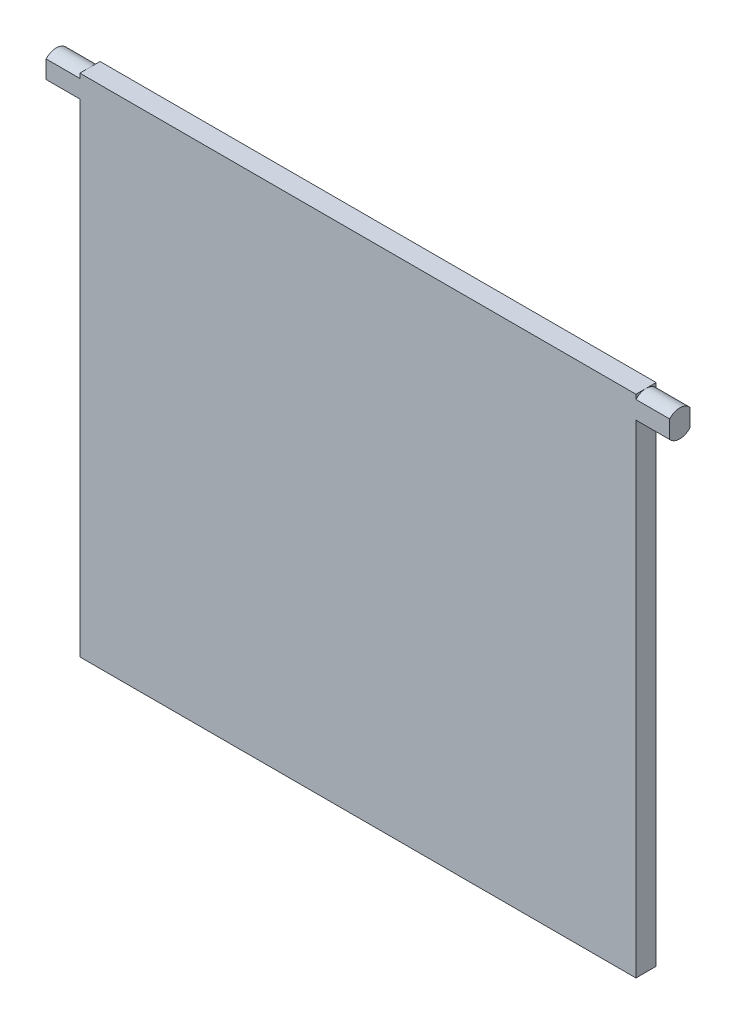
ISO-10303-21;
HEADER;
FILE_DESCRIPTION(('STEP AP214'),'2;1');
FILE_NAME('part.step','',(''),(''),'','','');
FILE_SCHEMA(('AUTOMOTIVE_DESIGN { 1 0 10303 214 1 1 1 1 }'));
ENDSEC;
DATA;
#1=APPLICATION_CONTEXT('core data for automotive mechanical design processes');
#2=APPLICATION_PROTOCOL_DEFINITION('international standard','automotive_design',2000,#1);
#3=PRODUCT_CONTEXT('',#1,'mechanical');
#4=PRODUCT('Part','Part','',(#3));
#5=PRODUCT_RELATED_PRODUCT_CATEGORY('part','',(#4));
#6=PRODUCT_DEFINITION_FORMATION('','',#4);
#7=PRODUCT_DEFINITION_CONTEXT('part definition',#1,'design');
#8=PRODUCT_DEFINITION('design','',#6,#7);
#9=PRODUCT_DEFINITION_SHAPE('','',#8);
#10=(LENGTH_UNIT() NAMED_UNIT(*) SI_UNIT(.MILLI.,.METRE.));
#11=(NAMED_UNIT(*) PLANE_ANGLE_UNIT() SI_UNIT($,.RADIAN.));
#12=(NAMED_UNIT(*) SI_UNIT($,.STERADIAN.) SOLID_ANGLE_UNIT());
#13=UNCERTAINTY_MEASURE_WITH_UNIT(LENGTH_MEASURE(1.E-05),#10,'distance_accuracy_value','');
#14=(GEOMETRIC_REPRESENTATION_CONTEXT(3) GLOBAL_UNCERTAINTY_ASSIGNED_CONTEXT((#13)) GLOBAL_UNIT_ASSIGNED_CONTEXT((#10,
#11,#12)) REPRESENTATION_CONTEXT('',''));
#15=CARTESIAN_POINT('',(0.,0.,0.));
#16=DIRECTION('',(0.,0.,1.));
#17=DIRECTION('',(1.,0.,0.));
#18=AXIS2_PLACEMENT_3D('',#15,#16,#17);
#19=CARTESIAN_POINT('',(0.,-1.2,1.2));
#20=DIRECTION('',(1.,0.,0.));
#21=DIRECTION('',(0.,1.,0.));
#22=AXIS2_PLACEMENT_3D('',#19,#20,#21);
#23=PLANE('',#22);
#24=DIRECTION('',(0.,-1.,0.));
#25=VECTOR('',#24,1.);
#26=CARTESIAN_POINT('',(0.,-1.2,0.));
#27=LINE('',#26,#25);
#28=CARTESIAN_POINT('',(0.,0.,0.));
#29=VERTEX_POINT('',#28);
#30=CARTESIAN_POINT('',(0.,-0.270849737787085,0.));
#31=VERTEX_POINT('',#30);
#32=EDGE_CURVE('E228',#29,#31,#27,.T.);
#33=ORIENTED_EDGE('',*,*,#32,.T.);
#34=CARTESIAN_POINT('',(0.,-0.800000000000004,0.6));
#35=DIRECTION('',(1.,0.,0.));
#36=DIRECTION('',(0.,0.,-1.));
#37=AXIS2_PLACEMENT_3D('',#34,#35,#36);
#38=CIRCLE('',#37,0.8);
#39=CARTESIAN_POINT('',(0.,0.,0.6));
#40=VERTEX_POINT('',#39);
#41=EDGE_CURVE('E53',#31,#40,#38,.T.);
#42=ORIENTED_EDGE('',*,*,#41,.T.);
#43=DIRECTION('',(0.,0.,-1.));
#44=VECTOR('',#43,1.);
#45=CARTESIAN_POINT('',(0.,0.,1.2));
#46=LINE('',#45,#44);
#47=EDGE_CURVE('E227',#40,#29,#46,.T.);
#48=ORIENTED_EDGE('',*,*,#47,.T.);
#49=EDGE_LOOP('',(#33,#42,#48));
#50=FACE_BOUND('',#49,.T.);
#51=ADVANCED_FACE('F41',(#50),#23,.F.);
#52=CARTESIAN_POINT('',(0.,0.,1.2));
#53=VERTEX_POINT('',#52);
#54=EDGE_CURVE('E244',#53,#40,#46,.T.);
#55=ORIENTED_EDGE('',*,*,#54,.T.);
#56=CARTESIAN_POINT('',(0.,-0.270849737787086,1.2));
#57=VERTEX_POINT('',#56);
#58=EDGE_CURVE('E11',#40,#57,#38,.T.);
#59=ORIENTED_EDGE('',*,*,#58,.T.);
#60=DIRECTION('',(0.,-1.,0.));
#61=VECTOR('',#60,1.);
#62=CARTESIAN_POINT('',(0.,-1.2,1.2));
#63=LINE('',#62,#61);
#64=EDGE_CURVE('E212',#53,#57,#63,.T.);
#65=ORIENTED_EDGE('',*,*,#64,.F.);
#66=EDGE_LOOP('',(#55,#59,#65));
#67=FACE_BOUND('',#66,.T.);
#68=ADVANCED_FACE('F299',(#67),#23,.F.);
#69=CARTESIAN_POINT('',(33.,-1.2,1.2));
#70=DIRECTION('',(-1.,0.,0.));
#71=DIRECTION('',(0.,0.,1.));
#72=AXIS2_PLACEMENT_3D('',#69,#70,#71);
#73=PLANE('',#72);
#74=CARTESIAN_POINT('',(33.,-0.8,0.6));
#75=DIRECTION('',(1.,0.,0.));
#76=DIRECTION('',(0.,0.,-1.));
#77=AXIS2_PLACEMENT_3D('',#74,#75,#76);
#78=CIRCLE('',#77,0.8);
#79=CARTESIAN_POINT('',(33.,-1.32915026221292,1.2));
#80=VERTEX_POINT('',#79);
#81=CARTESIAN_POINT('',(33.,-1.32915026221292,0.));
#82=VERTEX_POINT('',#81);
#83=EDGE_CURVE('E69',#80,#82,#78,.T.);
#84=ORIENTED_EDGE('',*,*,#83,.F.);
#85=DIRECTION('',(0.,1.,0.));
#86=VECTOR('',#85,1.);
#87=CARTESIAN_POINT('',(33.,-1.2,1.2));
#88=LINE('',#87,#86);
#89=CARTESIAN_POINT('',(33.,-30.,1.2));
#90=VERTEX_POINT('',#89);
#91=EDGE_CURVE('E221',#90,#80,#88,.T.);
#92=ORIENTED_EDGE('',*,*,#91,.F.);
#93=DIRECTION('',(0.,0.,-1.));
#94=VECTOR('',#93,1.);
#95=CARTESIAN_POINT('',(33.,-30.,1.2));
#96=LINE('',#95,#94);
#97=CARTESIAN_POINT('',(33.,-30.,0.));
#98=VERTEX_POINT('',#97);
#99=EDGE_CURVE('E252',#90,#98,#96,.T.);
#100=ORIENTED_EDGE('',*,*,#99,.T.);
#101=DIRECTION('',(0.,1.,0.));
#102=VECTOR('',#101,1.);
#103=CARTESIAN_POINT('',(33.,-1.2,0.));
#104=LINE('',#103,#102);
#105=EDGE_CURVE('E237',#98,#82,#104,.T.);
#106=ORIENTED_EDGE('',*,*,#105,.T.);
#107=EDGE_LOOP('',(#84,#92,#100,#106));
#108=FACE_BOUND('',#107,.T.);
#109=ADVANCED_FACE('F307',(#108),#73,.F.);
#110=CARTESIAN_POINT('',(33.,-0.270849737787081,0.));
#111=VERTEX_POINT('',#110);
#112=CARTESIAN_POINT('',(33.,0.,0.6));
#113=VERTEX_POINT('',#112);
#114=EDGE_CURVE('E151',#111,#113,#78,.T.);
#115=ORIENTED_EDGE('',*,*,#114,.F.);
#116=CARTESIAN_POINT('',(33.,0.,0.));
#117=VERTEX_POINT('',#116);
#118=EDGE_CURVE('E236',#111,#117,#104,.T.);
#119=ORIENTED_EDGE('',*,*,#118,.T.);
#120=DIRECTION('',(0.,0.,-1.));
#121=VECTOR('',#120,1.);
#122=CARTESIAN_POINT('',(33.,0.,1.2));
#123=LINE('',#122,#121);
#124=EDGE_CURVE('E248',#113,#117,#123,.T.);
#125=ORIENTED_EDGE('',*,*,#124,.F.);
#126=EDGE_LOOP('',(#115,#119,#125));
#127=FACE_BOUND('',#126,.T.);
#128=ADVANCED_FACE('F293',(#127),#73,.F.);
#129=CARTESIAN_POINT('',(0.,-1.32915026221292,1.2));
#130=VERTEX_POINT('',#129);
#131=CARTESIAN_POINT('',(0.,-30.,1.2));
#132=VERTEX_POINT('',#131);
#133=EDGE_CURVE('E217',#130,#132,#63,.T.);
#134=ORIENTED_EDGE('',*,*,#133,.F.);
#135=CARTESIAN_POINT('',(0.,-1.32915026221292,0.));
#136=VERTEX_POINT('',#135);
#137=EDGE_CURVE('E54',#130,#136,#38,.T.);
#138=ORIENTED_EDGE('',*,*,#137,.T.);
#139=CARTESIAN_POINT('',(0.,-30.,0.));
#140=VERTEX_POINT('',#139);
#141=EDGE_CURVE('E149',#136,#140,#27,.T.);
#142=ORIENTED_EDGE('',*,*,#141,.T.);
#143=DIRECTION('',(0.,0.,-1.));
#144=VECTOR('',#143,1.);
#145=CARTESIAN_POINT('',(0.,-30.,1.2));
#146=LINE('',#145,#144);
#147=EDGE_CURVE('E45',#132,#140,#146,.T.);
#148=ORIENTED_EDGE('',*,*,#147,.F.);
#149=EDGE_LOOP('',(#134,#138,#142,#148));
#150=FACE_BOUND('',#149,.T.);
#151=ADVANCED_FACE('F43',(#150),#23,.F.);
#152=CARTESIAN_POINT('',(0.,-30.,1.2));
#153=DIRECTION('',(0.,1.,0.));
#154=DIRECTION('',(-1.,0.,0.));
#155=AXIS2_PLACEMENT_3D('',#152,#153,#154);
#156=PLANE('',#155);
#157=DIRECTION('',(1.,0.,0.));
#158=VECTOR('',#157,1.);
#159=CARTESIAN_POINT('',(0.,-30.,0.));
#160=LINE('',#159,#158);
#161=EDGE_CURVE('E232',#140,#98,#160,.T.);
#162=ORIENTED_EDGE('',*,*,#161,.T.);
#163=ORIENTED_EDGE('',*,*,#99,.F.);
#164=DIRECTION('',(1.,0.,0.));
#165=VECTOR('',#164,1.);
#166=CARTESIAN_POINT('',(0.,-30.,1.2));
#167=LINE('',#166,#165);
#168=EDGE_CURVE('E216',#132,#90,#167,.T.);
#169=ORIENTED_EDGE('',*,*,#168,.F.);
#170=ORIENTED_EDGE('',*,*,#147,.T.);
#171=EDGE_LOOP('',(#162,#163,#169,#170));
#172=FACE_BOUND('',#171,.T.);
#173=ADVANCED_FACE('F305',(#172),#156,.F.);
#174=CARTESIAN_POINT('',(33.,-0.270849737787082,1.2));
#175=VERTEX_POINT('',#174);
#176=EDGE_CURVE('E51',#113,#175,#78,.T.);
#177=ORIENTED_EDGE('',*,*,#176,.F.);
#178=CARTESIAN_POINT('',(33.,0.,1.2));
#179=VERTEX_POINT('',#178);
#180=EDGE_CURVE('E249',#179,#113,#123,.T.);
#181=ORIENTED_EDGE('',*,*,#180,.F.);
#182=EDGE_CURVE('E220',#175,#179,#88,.T.);
#183=ORIENTED_EDGE('',*,*,#182,.F.);
#184=EDGE_LOOP('',(#177,#181,#183));
#185=FACE_BOUND('',#184,.T.);
#186=ADVANCED_FACE('F303',(#185),#73,.F.);
#187=CARTESIAN_POINT('',(0.,0.,1.2));
#188=DIRECTION('',(0.,-1.,0.));
#189=DIRECTION('',(1.,0.,0.));
#190=AXIS2_PLACEMENT_3D('',#187,#188,#189);
#191=PLANE('',#190);
#192=DIRECTION('',(-1.,0.,0.));
#193=VECTOR('',#192,1.);
#194=CARTESIAN_POINT('',(0.,0.,0.));
#195=LINE('',#194,#193);
#196=EDGE_CURVE('E240',#117,#29,#195,.T.);
#197=ORIENTED_EDGE('',*,*,#196,.T.);
#198=ORIENTED_EDGE('',*,*,#47,.F.);
#199=ORIENTED_EDGE('',*,*,#54,.F.);
#200=DIRECTION('',(-1.,0.,0.));
#201=VECTOR('',#200,1.);
#202=CARTESIAN_POINT('',(0.,0.,1.2));
#203=LINE('',#202,#201);
#204=EDGE_CURVE('E224',#179,#53,#203,.T.);
#205=ORIENTED_EDGE('',*,*,#204,.F.);
#206=ORIENTED_EDGE('',*,*,#180,.T.);
#207=ORIENTED_EDGE('',*,*,#124,.T.);
#208=EDGE_LOOP('',(#197,#198,#199,#205,#206,#207));
#209=FACE_BOUND('',#208,.T.);
#210=ADVANCED_FACE('F287',(#209),#191,.F.);
#211=CARTESIAN_POINT('',(0.,0.,1.2));
#212=DIRECTION('',(0.,0.,-1.));
#213=DIRECTION('',(-1.,0.,0.));
#214=AXIS2_PLACEMENT_3D('',#211,#212,#213);
#215=PLANE('',#214);
#216=ORIENTED_EDGE('',*,*,#64,.T.);
#217=DIRECTION('',(1.,0.,0.));
#218=VECTOR('',#217,1.);
#219=CARTESIAN_POINT('',(-2.,-0.270849737787086,1.2));
#220=LINE('',#219,#218);
#221=CARTESIAN_POINT('',(-2.,-0.270849737787086,1.2));
#222=VERTEX_POINT('',#221);
#223=EDGE_CURVE('E174',#222,#57,#220,.T.);
#224=ORIENTED_EDGE('',*,*,#223,.F.);
#225=DIRECTION('',(0.,-1.,0.));
#226=VECTOR('',#225,1.);
#227=CARTESIAN_POINT('',(-2.,0.,1.2));
#228=LINE('',#227,#226);
#229=CARTESIAN_POINT('',(-2.,-1.32915026221292,1.2));
#230=VERTEX_POINT('',#229);
#231=EDGE_CURVE('E166',#222,#230,#228,.T.);
#232=ORIENTED_EDGE('',*,*,#231,.T.);
#233=DIRECTION('',(1.,0.,0.));
#234=VECTOR('',#233,1.);
#235=CARTESIAN_POINT('',(-2.,-1.32915026221292,1.2));
#236=LINE('',#235,#234);
#237=EDGE_CURVE('E152',#230,#130,#236,.T.);
#238=ORIENTED_EDGE('',*,*,#237,.T.);
#239=ORIENTED_EDGE('',*,*,#133,.T.);
#240=ORIENTED_EDGE('',*,*,#168,.T.);
#241=ORIENTED_EDGE('',*,*,#91,.T.);
#242=DIRECTION('',(-1.,0.,0.));
#243=VECTOR('',#242,1.);
#244=CARTESIAN_POINT('',(35.,-1.32915026221292,1.2));
#245=LINE('',#244,#243);
#246=CARTESIAN_POINT('',(35.,-1.32915026221292,1.2));
#247=VERTEX_POINT('',#246);
#248=EDGE_CURVE('E200',#247,#80,#245,.T.);
#249=ORIENTED_EDGE('',*,*,#248,.F.);
#250=DIRECTION('',(0.,-1.,0.));
#251=VECTOR('',#250,1.);
#252=CARTESIAN_POINT('',(35.,0.,1.2));
#253=LINE('',#252,#251);
#254=CARTESIAN_POINT('',(35.,-0.270849737787082,1.2));
#255=VERTEX_POINT('',#254);
#256=EDGE_CURVE('E189',#255,#247,#253,.T.);
#257=ORIENTED_EDGE('',*,*,#256,.F.);
#258=DIRECTION('',(-1.,0.,0.));
#259=VECTOR('',#258,1.);
#260=CARTESIAN_POINT('',(35.,-0.270849737787082,1.2));
#261=LINE('',#260,#259);
#262=EDGE_CURVE('E204',#255,#175,#261,.T.);
#263=ORIENTED_EDGE('',*,*,#262,.T.);
#264=ORIENTED_EDGE('',*,*,#182,.T.);
#265=ORIENTED_EDGE('',*,*,#204,.T.);
#266=EDGE_LOOP('',(#216,#224,#232,#238,#239,#240,#241,#249,#257,#263,#264,#265));
#267=FACE_BOUND('',#266,.T.);
#268=ADVANCED_FACE('F301',(#267),#215,.F.);
#269=CARTESIAN_POINT('',(0.,0.,0.));
#270=DIRECTION('',(0.,0.,-1.));
#271=DIRECTION('',(-1.,0.,0.));
#272=AXIS2_PLACEMENT_3D('',#269,#270,#271);
#273=PLANE('',#272);
#274=ORIENTED_EDGE('',*,*,#32,.F.);
#275=ORIENTED_EDGE('',*,*,#196,.F.);
#276=ORIENTED_EDGE('',*,*,#118,.F.);
#277=DIRECTION('',(-1.,0.,0.));
#278=VECTOR('',#277,1.);
#279=CARTESIAN_POINT('',(35.,-0.270849737787081,0.));
#280=LINE('',#279,#278);
#281=CARTESIAN_POINT('',(35.,-0.270849737787081,0.));
#282=VERTEX_POINT('',#281);
#283=EDGE_CURVE('E208',#282,#111,#280,.T.);
#284=ORIENTED_EDGE('',*,*,#283,.F.);
#285=DIRECTION('',(0.,1.,0.));
#286=VECTOR('',#285,1.);
#287=CARTESIAN_POINT('',(35.,0.,0.));
#288=LINE('',#287,#286);
#289=CARTESIAN_POINT('',(35.,-1.32915026221292,0.));
#290=VERTEX_POINT('',#289);
#291=EDGE_CURVE('E182',#290,#282,#288,.T.);
#292=ORIENTED_EDGE('',*,*,#291,.F.);
#293=DIRECTION('',(-1.,0.,0.));
#294=VECTOR('',#293,1.);
#295=CARTESIAN_POINT('',(35.,-1.32915026221292,0.));
#296=LINE('',#295,#294);
#297=EDGE_CURVE('E196',#290,#82,#296,.T.);
#298=ORIENTED_EDGE('',*,*,#297,.T.);
#299=ORIENTED_EDGE('',*,*,#105,.F.);
#300=ORIENTED_EDGE('',*,*,#161,.F.);
#301=ORIENTED_EDGE('',*,*,#141,.F.);
#302=DIRECTION('',(1.,0.,0.));
#303=VECTOR('',#302,1.);
#304=CARTESIAN_POINT('',(-2.,-1.32915026221292,0.));
#305=LINE('',#304,#303);
#306=CARTESIAN_POINT('',(-2.,-1.32915026221292,0.));
#307=VERTEX_POINT('',#306);
#308=EDGE_CURVE('E61',#307,#136,#305,.T.);
#309=ORIENTED_EDGE('',*,*,#308,.F.);
#310=DIRECTION('',(0.,1.,0.));
#311=VECTOR('',#310,1.);
#312=CARTESIAN_POINT('',(-2.,0.,0.));
#313=LINE('',#312,#311);
#314=CARTESIAN_POINT('',(-2.,-0.270849737787086,0.));
#315=VERTEX_POINT('',#314);
#316=EDGE_CURVE('E146',#307,#315,#313,.T.);
#317=ORIENTED_EDGE('',*,*,#316,.T.);
#318=DIRECTION('',(1.,0.,0.));
#319=VECTOR('',#318,1.);
#320=CARTESIAN_POINT('',(-2.,-0.270849737787086,0.));
#321=LINE('',#320,#319);
#322=EDGE_CURVE('E171',#315,#31,#321,.T.);
#323=ORIENTED_EDGE('',*,*,#322,.T.);
#324=EDGE_LOOP('',(#274,#275,#276,#284,#292,#298,#299,#300,#301,#309,#317,#323));
#325=FACE_BOUND('',#324,.T.);
#326=ADVANCED_FACE('F145',(#325),#273,.T.);
#327=CARTESIAN_POINT('',(35.,-0.8,0.6));
#328=DIRECTION('',(-1.,0.,0.));
#329=DIRECTION('',(0.,0.,1.));
#330=AXIS2_PLACEMENT_3D('',#327,#328,#329);
#331=CYLINDRICAL_SURFACE('',#330,0.8);
#332=ORIENTED_EDGE('',*,*,#114,.T.);
#333=ORIENTED_EDGE('',*,*,#176,.T.);
#334=ORIENTED_EDGE('',*,*,#262,.F.);
#335=CARTESIAN_POINT('',(35.,-0.8,0.6));
#336=DIRECTION('',(1.,0.,0.));
#337=DIRECTION('',(0.,0.,-1.));
#338=AXIS2_PLACEMENT_3D('',#335,#336,#337);
#339=CIRCLE('',#338,0.8);
#340=EDGE_CURVE('E186',#282,#255,#339,.T.);
#341=ORIENTED_EDGE('',*,*,#340,.F.);
#342=ORIENTED_EDGE('',*,*,#283,.T.);
#343=EDGE_LOOP('',(#332,#333,#334,#341,#342));
#344=FACE_BOUND('',#343,.T.);
#345=ADVANCED_FACE('F358',(#344),#331,.T.);
#346=ORIENTED_EDGE('',*,*,#83,.T.);
#347=ORIENTED_EDGE('',*,*,#297,.F.);
#348=EDGE_CURVE('E190',#247,#290,#339,.T.);
#349=ORIENTED_EDGE('',*,*,#348,.F.);
#350=ORIENTED_EDGE('',*,*,#248,.T.);
#351=EDGE_LOOP('',(#346,#347,#349,#350));
#352=FACE_BOUND('',#351,.T.);
#353=ADVANCED_FACE('F268',(#352),#331,.T.);
#354=CARTESIAN_POINT('',(35.,0.,0.));
#355=DIRECTION('',(1.,0.,0.));
#356=DIRECTION('',(0.,0.,-1.));
#357=AXIS2_PLACEMENT_3D('',#354,#355,#356);
#358=PLANE('',#357);
#359=ORIENTED_EDGE('',*,*,#291,.T.);
#360=ORIENTED_EDGE('',*,*,#340,.T.);
#361=ORIENTED_EDGE('',*,*,#256,.T.);
#362=ORIENTED_EDGE('',*,*,#348,.T.);
#363=EDGE_LOOP('',(#359,#360,#361,#362));
#364=FACE_BOUND('',#363,.T.);
#365=ADVANCED_FACE('F275',(#364),#358,.T.);
#366=CARTESIAN_POINT('',(-2.,-0.800000000000005,0.6));
#367=DIRECTION('',(1.,0.,0.));
#368=DIRECTION('',(0.,1.,0.));
#369=AXIS2_PLACEMENT_3D('',#366,#367,#368);
#370=CYLINDRICAL_SURFACE('',#369,0.8);
#371=ORIENTED_EDGE('',*,*,#137,.F.);
#372=ORIENTED_EDGE('',*,*,#237,.F.);
#373=CARTESIAN_POINT('',(-2.,-0.800000000000005,0.6));
#374=DIRECTION('',(1.,0.,0.));
#375=DIRECTION('',(0.,0.,-1.));
#376=AXIS2_PLACEMENT_3D('',#373,#374,#375);
#377=CIRCLE('',#376,0.8);
#378=EDGE_CURVE('E158',#230,#307,#377,.T.);
#379=ORIENTED_EDGE('',*,*,#378,.T.);
#380=ORIENTED_EDGE('',*,*,#308,.T.);
#381=EDGE_LOOP('',(#371,#372,#379,#380));
#382=FACE_BOUND('',#381,.T.);
#383=ADVANCED_FACE('F164',(#382),#370,.T.);
#384=ORIENTED_EDGE('',*,*,#41,.F.);
#385=ORIENTED_EDGE('',*,*,#322,.F.);
#386=EDGE_CURVE('E161',#315,#222,#377,.T.);
#387=ORIENTED_EDGE('',*,*,#386,.T.);
#388=ORIENTED_EDGE('',*,*,#223,.T.);
#389=ORIENTED_EDGE('',*,*,#58,.F.);
#390=EDGE_LOOP('',(#384,#385,#387,#388,#389));
#391=FACE_BOUND('',#390,.T.);
#392=ADVANCED_FACE('F423',(#391),#370,.T.);
#393=CARTESIAN_POINT('',(-2.,0.,0.));
#394=DIRECTION('',(-1.,0.,0.));
#395=DIRECTION('',(0.,0.,-1.));
#396=AXIS2_PLACEMENT_3D('',#393,#394,#395);
#397=PLANE('',#396);
#398=ORIENTED_EDGE('',*,*,#316,.F.);
#399=ORIENTED_EDGE('',*,*,#378,.F.);
#400=ORIENTED_EDGE('',*,*,#231,.F.);
#401=ORIENTED_EDGE('',*,*,#386,.F.);
#402=EDGE_LOOP('',(#398,#399,#400,#401));
#403=FACE_BOUND('',#402,.T.);
#404=ADVANCED_FACE('F156',(#403),#397,.T.);
#405=CLOSED_SHELL('',(#51,#68,#109,#128,#151,#173,#186,#210,#268,#326,#345,#353,#365,#383,#392,#404));
#406=MANIFOLD_SOLID_BREP('B2',#405);
#407=ADVANCED_BREP_SHAPE_REPRESENTATION('',(#18,#406),#14);
#408=SHAPE_DEFINITION_REPRESENTATION(#9,#407);
ENDSEC;
END-ISO-10303-21;
